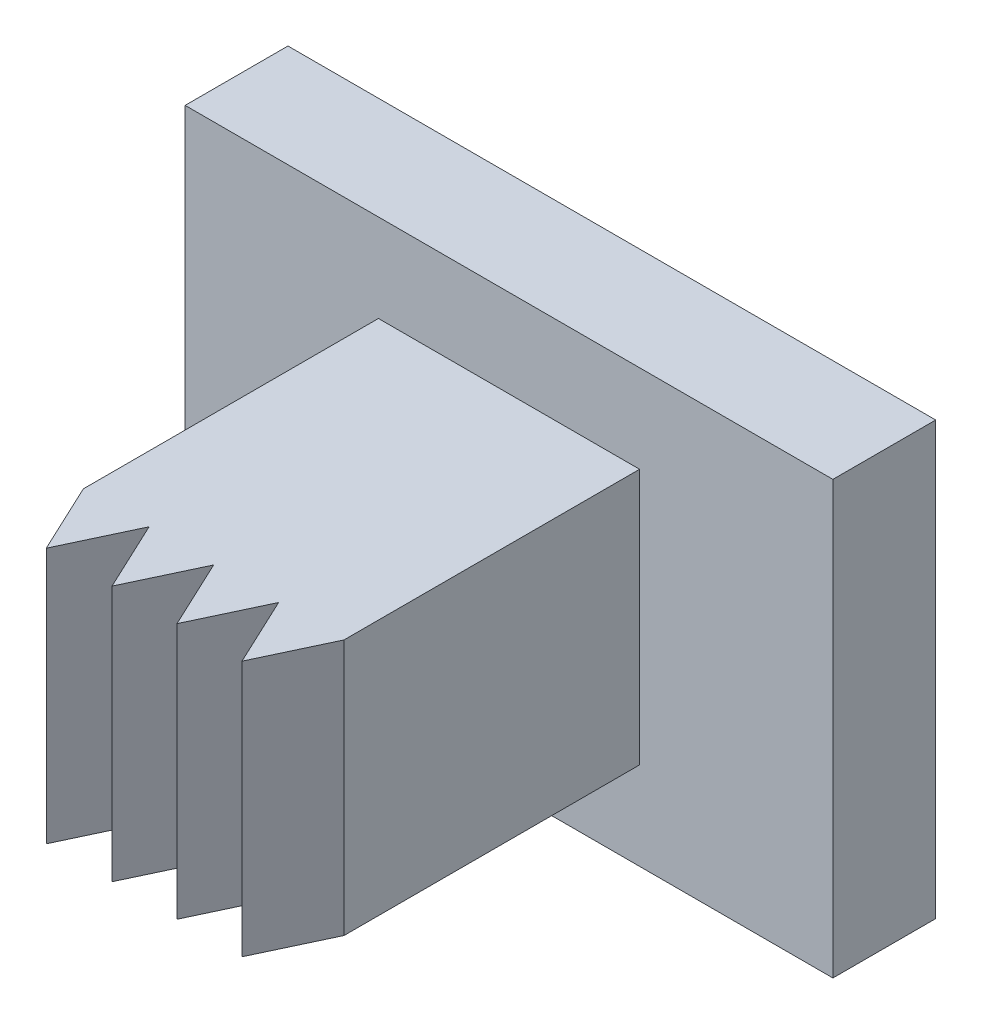
ISO-10303-21;
HEADER;
FILE_DESCRIPTION(('STEP AP214'),'2;1');
FILE_NAME('part.step','',(''),(''),'','','');
FILE_SCHEMA(('AUTOMOTIVE_DESIGN { 1 0 10303 214 1 1 1 1 }'));
ENDSEC;
DATA;
#1=APPLICATION_CONTEXT('core data for automotive mechanical design processes');
#2=APPLICATION_PROTOCOL_DEFINITION('international standard','automotive_design',2000,#1);
#3=PRODUCT_CONTEXT('',#1,'mechanical');
#4=PRODUCT('Part','Part','',(#3));
#5=PRODUCT_RELATED_PRODUCT_CATEGORY('part','',(#4));
#6=PRODUCT_DEFINITION_FORMATION('','',#4);
#7=PRODUCT_DEFINITION_CONTEXT('part definition',#1,'design');
#8=PRODUCT_DEFINITION('design','',#6,#7);
#9=PRODUCT_DEFINITION_SHAPE('','',#8);
#10=(LENGTH_UNIT() NAMED_UNIT(*) SI_UNIT(.MILLI.,.METRE.));
#11=(NAMED_UNIT(*) PLANE_ANGLE_UNIT() SI_UNIT($,.RADIAN.));
#12=(NAMED_UNIT(*) SI_UNIT($,.STERADIAN.) SOLID_ANGLE_UNIT());
#13=UNCERTAINTY_MEASURE_WITH_UNIT(LENGTH_MEASURE(1.E-05),#10,'distance_accuracy_value','');
#14=(GEOMETRIC_REPRESENTATION_CONTEXT(3) GLOBAL_UNCERTAINTY_ASSIGNED_CONTEXT((#13)) GLOBAL_UNIT_ASSIGNED_CONTEXT((#10,
#11,#12)) REPRESENTATION_CONTEXT('',''));
#15=CARTESIAN_POINT('',(0.,0.,0.));
#16=DIRECTION('',(0.,0.,1.));
#17=DIRECTION('',(1.,0.,0.));
#18=AXIS2_PLACEMENT_3D('',#15,#16,#17);
#19=CARTESIAN_POINT('',(0.004562755256311,-1.245,2.87731557566732));
#20=DIRECTION('',(0.905074933327661,0.,-0.425252119409099));
#21=DIRECTION('',(-0.425252119409099,0.,-0.905074933327661));
#22=AXIS2_PLACEMENT_3D('',#19,#20,#21);
#23=PLANE('',#22);
#24=DIRECTION('',(0.,1.,0.));
#25=VECTOR('',#24,1.);
#26=CARTESIAN_POINT('',(0.00456275525631186,-1.245,2.87731557566732));
#27=LINE('',#26,#25);
#28=CARTESIAN_POINT('',(0.00456275525631165,1.245,2.87731557566732));
#29=VERTEX_POINT('',#28);
#30=CARTESIAN_POINT('',(0.00456275525631126,-1.245,2.87731557566732));
#31=VERTEX_POINT('',#30);
#32=EDGE_CURVE('E159',#29,#31,#27,.F.);
#33=ORIENTED_EDGE('',*,*,#32,.T.);
#34=DIRECTION('',(-0.425252119409099,0.,-0.905074933327661));
#35=VECTOR('',#34,1.);
#36=CARTESIAN_POINT('',(0.004562755256311,-1.245,2.87731557566732));
#37=LINE('',#36,#35);
#38=CARTESIAN_POINT('',(0.320625510512622,-1.245,3.55));
#39=VERTEX_POINT('',#38);
#40=EDGE_CURVE('E20',#39,#31,#37,.T.);
#41=ORIENTED_EDGE('',*,*,#40,.F.);
#42=DIRECTION('',(0.,1.,0.));
#43=VECTOR('',#42,1.);
#44=CARTESIAN_POINT('',(0.320625510512622,-1.245,3.55));
#45=LINE('',#44,#43);
#46=CARTESIAN_POINT('',(0.320625510512622,1.245,3.55));
#47=VERTEX_POINT('',#46);
#48=EDGE_CURVE('E169',#39,#47,#45,.T.);
#49=ORIENTED_EDGE('',*,*,#48,.T.);
#50=DIRECTION('',(-0.425252119409099,0.,-0.905074933327661));
#51=VECTOR('',#50,1.);
#52=CARTESIAN_POINT('',(0.00456275525631123,1.245,2.87731557566732));
#53=LINE('',#52,#51);
#54=EDGE_CURVE('E144',#29,#47,#53,.F.);
#55=ORIENTED_EDGE('',*,*,#54,.F.);
#56=EDGE_LOOP('',(#33,#41,#49,#55));
#57=FACE_BOUND('',#56,.T.);
#58=ADVANCED_FACE('F17',(#57),#23,.F.);
#59=CARTESIAN_POINT('',(-0.3115,-1.245,3.55));
#60=DIRECTION('',(-0.90507493332766,0.,-0.4252521194091));
#61=DIRECTION('',(-0.4252521194091,0.,0.90507493332766));
#62=AXIS2_PLACEMENT_3D('',#59,#60,#61);
#63=PLANE('',#62);
#64=DIRECTION('',(0.,1.,0.));
#65=VECTOR('',#64,1.);
#66=CARTESIAN_POINT('',(-0.3115,-1.245,3.55));
#67=LINE('',#66,#65);
#68=CARTESIAN_POINT('',(-0.3115,1.245,3.55));
#69=VERTEX_POINT('',#68);
#70=CARTESIAN_POINT('',(-0.3115,-1.245,3.55));
#71=VERTEX_POINT('',#70);
#72=EDGE_CURVE('E162',#69,#71,#67,.F.);
#73=ORIENTED_EDGE('',*,*,#72,.T.);
#74=DIRECTION('',(-0.4252521194091,0.,0.90507493332766));
#75=VECTOR('',#74,1.);
#76=CARTESIAN_POINT('',(-0.3115,-1.245,3.55));
#77=LINE('',#76,#75);
#78=EDGE_CURVE('E151',#31,#71,#77,.T.);
#79=ORIENTED_EDGE('',*,*,#78,.F.);
#80=ORIENTED_EDGE('',*,*,#32,.F.);
#81=DIRECTION('',(-0.4252521194091,0.,0.90507493332766));
#82=VECTOR('',#81,1.);
#83=CARTESIAN_POINT('',(-0.3115,1.245,3.55));
#84=LINE('',#83,#82);
#85=EDGE_CURVE('E163',#69,#29,#84,.F.);
#86=ORIENTED_EDGE('',*,*,#85,.F.);
#87=EDGE_LOOP('',(#73,#79,#80,#86));
#88=FACE_BOUND('',#87,.T.);
#89=ADVANCED_FACE('F158',(#88),#63,.F.);
#90=CARTESIAN_POINT('',(0.320625510512622,-1.245,3.55));
#91=DIRECTION('',(-0.90507493332766,0.,-0.4252521194091));
#92=DIRECTION('',(-0.4252521194091,0.,0.90507493332766));
#93=AXIS2_PLACEMENT_3D('',#90,#91,#92);
#94=PLANE('',#93);
#95=ORIENTED_EDGE('',*,*,#48,.F.);
#96=DIRECTION('',(-0.4252521194091,0.,0.90507493332766));
#97=VECTOR('',#96,1.);
#98=CARTESIAN_POINT('',(0.320625510512622,-1.245,3.55));
#99=LINE('',#98,#97);
#100=CARTESIAN_POINT('',(0.636688265768935,-1.245,2.87731557566732));
#101=VERTEX_POINT('',#100);
#102=EDGE_CURVE('E154',#101,#39,#99,.T.);
#103=ORIENTED_EDGE('',*,*,#102,.F.);
#104=DIRECTION('',(0.,1.,0.));
#105=VECTOR('',#104,1.);
#106=CARTESIAN_POINT('',(0.636688265768935,-1.245,2.87731557566732));
#107=LINE('',#106,#105);
#108=CARTESIAN_POINT('',(0.636688265768935,1.245,2.87731557566732));
#109=VERTEX_POINT('',#108);
#110=EDGE_CURVE('E181',#101,#109,#107,.T.);
#111=ORIENTED_EDGE('',*,*,#110,.T.);
#112=DIRECTION('',(-0.4252521194091,0.,0.90507493332766));
#113=VECTOR('',#112,1.);
#114=CARTESIAN_POINT('',(0.320625510512622,1.245,3.55));
#115=LINE('',#114,#113);
#116=EDGE_CURVE('E171',#47,#109,#115,.F.);
#117=ORIENTED_EDGE('',*,*,#116,.F.);
#118=EDGE_LOOP('',(#95,#103,#111,#117));
#119=FACE_BOUND('',#118,.T.);
#120=ADVANCED_FACE('F377',(#119),#94,.F.);
#121=CARTESIAN_POINT('',(-0.631,-1.245,2.87));
#122=DIRECTION('',(0.905074933327661,0.,-0.425252119409099));
#123=DIRECTION('',(-0.425252119409099,0.,-0.905074933327661));
#124=AXIS2_PLACEMENT_3D('',#121,#122,#123);
#125=PLANE('',#124);
#126=DIRECTION('',(0.,1.,0.));
#127=VECTOR('',#126,1.);
#128=CARTESIAN_POINT('',(-0.630999999999999,-1.245,2.87));
#129=LINE('',#128,#127);
#130=CARTESIAN_POINT('',(-0.630999999999999,1.245,2.87));
#131=VERTEX_POINT('',#130);
#132=CARTESIAN_POINT('',(-0.631,-1.245,2.87));
#133=VERTEX_POINT('',#132);
#134=EDGE_CURVE('E186',#131,#133,#129,.F.);
#135=ORIENTED_EDGE('',*,*,#134,.T.);
#136=DIRECTION('',(-0.425252119409099,0.,-0.905074933327661));
#137=VECTOR('',#136,1.);
#138=CARTESIAN_POINT('',(-0.631,-1.245,2.87));
#139=LINE('',#138,#137);
#140=EDGE_CURVE('E174',#71,#133,#139,.T.);
#141=ORIENTED_EDGE('',*,*,#140,.F.);
#142=ORIENTED_EDGE('',*,*,#72,.F.);
#143=DIRECTION('',(-0.425252119409099,0.,-0.905074933327661));
#144=VECTOR('',#143,1.);
#145=CARTESIAN_POINT('',(-0.631,1.245,2.87));
#146=LINE('',#145,#144);
#147=EDGE_CURVE('E176',#131,#69,#146,.F.);
#148=ORIENTED_EDGE('',*,*,#147,.F.);
#149=EDGE_LOOP('',(#135,#141,#142,#148));
#150=FACE_BOUND('',#149,.T.);
#151=ADVANCED_FACE('F373',(#150),#125,.F.);
#152=CARTESIAN_POINT('',(0.636688265768935,-1.245,2.87731557566732));
#153=DIRECTION('',(0.905074933327661,0.,-0.425252119409099));
#154=DIRECTION('',(-0.425252119409099,0.,-0.905074933327661));
#155=AXIS2_PLACEMENT_3D('',#152,#153,#154);
#156=PLANE('',#155);
#157=ORIENTED_EDGE('',*,*,#110,.F.);
#158=DIRECTION('',(-0.425252119409099,0.,-0.905074933327661));
#159=VECTOR('',#158,1.);
#160=CARTESIAN_POINT('',(0.636688265768935,-1.245,2.87731557566732));
#161=LINE('',#160,#159);
#162=CARTESIAN_POINT('',(0.952751021025247,-1.245,3.55));
#163=VERTEX_POINT('',#162);
#164=EDGE_CURVE('E179',#163,#101,#161,.T.);
#165=ORIENTED_EDGE('',*,*,#164,.F.);
#166=DIRECTION('',(0.,1.,0.));
#167=VECTOR('',#166,1.);
#168=CARTESIAN_POINT('',(0.952751021025247,-1.245,3.55));
#169=LINE('',#168,#167);
#170=CARTESIAN_POINT('',(0.952751021025247,1.245,3.55));
#171=VERTEX_POINT('',#170);
#172=EDGE_CURVE('E197',#163,#171,#169,.T.);
#173=ORIENTED_EDGE('',*,*,#172,.T.);
#174=DIRECTION('',(-0.425252119409099,0.,-0.905074933327661));
#175=VECTOR('',#174,1.);
#176=CARTESIAN_POINT('',(0.636688265768935,1.245,2.87731557566732));
#177=LINE('',#176,#175);
#178=EDGE_CURVE('E184',#109,#171,#177,.F.);
#179=ORIENTED_EDGE('',*,*,#178,.F.);
#180=EDGE_LOOP('',(#157,#165,#173,#179));
#181=FACE_BOUND('',#180,.T.);
#182=ADVANCED_FACE('F369',(#181),#156,.F.);
#183=CARTESIAN_POINT('',(-0.9505,-1.245,3.55));
#184=DIRECTION('',(-0.90507493332766,0.,-0.4252521194091));
#185=DIRECTION('',(-0.4252521194091,0.,0.90507493332766));
#186=AXIS2_PLACEMENT_3D('',#183,#184,#185);
#187=PLANE('',#186);
#188=DIRECTION('',(0.,1.,0.));
#189=VECTOR('',#188,1.);
#190=CARTESIAN_POINT('',(-0.9505,-1.245,3.55));
#191=LINE('',#190,#189);
#192=CARTESIAN_POINT('',(-0.9505,1.245,3.55));
#193=VERTEX_POINT('',#192);
#194=CARTESIAN_POINT('',(-0.9505,-1.245,3.55));
#195=VERTEX_POINT('',#194);
#196=EDGE_CURVE('E202',#193,#195,#191,.F.);
#197=ORIENTED_EDGE('',*,*,#196,.T.);
#198=DIRECTION('',(-0.4252521194091,0.,0.90507493332766));
#199=VECTOR('',#198,1.);
#200=CARTESIAN_POINT('',(-0.9505,-1.245,3.55));
#201=LINE('',#200,#199);
#202=EDGE_CURVE('E189',#133,#195,#201,.T.);
#203=ORIENTED_EDGE('',*,*,#202,.F.);
#204=ORIENTED_EDGE('',*,*,#134,.F.);
#205=DIRECTION('',(-0.4252521194091,0.,0.90507493332766));
#206=VECTOR('',#205,1.);
#207=CARTESIAN_POINT('',(-0.9505,1.245,3.55));
#208=LINE('',#207,#206);
#209=EDGE_CURVE('E191',#193,#131,#208,.F.);
#210=ORIENTED_EDGE('',*,*,#209,.F.);
#211=EDGE_LOOP('',(#197,#203,#204,#210));
#212=FACE_BOUND('',#211,.T.);
#213=ADVANCED_FACE('F365',(#212),#187,.F.);
#214=CARTESIAN_POINT('',(0.952751021025247,-1.245,3.55));
#215=DIRECTION('',(-0.90507493332766,0.,-0.425252119409101));
#216=DIRECTION('',(-0.425252119409101,0.,0.90507493332766));
#217=AXIS2_PLACEMENT_3D('',#214,#215,#216);
#218=PLANE('',#217);
#219=ORIENTED_EDGE('',*,*,#172,.F.);
#220=DIRECTION('',(-0.425252119409101,0.,0.90507493332766));
#221=VECTOR('',#220,1.);
#222=CARTESIAN_POINT('',(0.952751021025247,-1.245,3.55));
#223=LINE('',#222,#221);
#224=CARTESIAN_POINT('',(1.27,-1.245,2.87479090546845));
#225=VERTEX_POINT('',#224);
#226=EDGE_CURVE('E194',#225,#163,#223,.T.);
#227=ORIENTED_EDGE('',*,*,#226,.F.);
#228=DIRECTION('',(0.,1.,0.));
#229=VECTOR('',#228,1.);
#230=CARTESIAN_POINT('',(1.27,1.245,2.87479090546845));
#231=LINE('',#230,#229);
#232=CARTESIAN_POINT('',(1.27,1.245,2.87479090546845));
#233=VERTEX_POINT('',#232);
#234=EDGE_CURVE('E208',#233,#225,#231,.F.);
#235=ORIENTED_EDGE('',*,*,#234,.F.);
#236=DIRECTION('',(-0.425252119409101,0.,0.90507493332766));
#237=VECTOR('',#236,1.);
#238=CARTESIAN_POINT('',(0.952751021025247,1.245,3.55));
#239=LINE('',#238,#237);
#240=EDGE_CURVE('E200',#171,#233,#239,.F.);
#241=ORIENTED_EDGE('',*,*,#240,.F.);
#242=EDGE_LOOP('',(#219,#227,#235,#241));
#243=FACE_BOUND('',#242,.T.);
#244=ADVANCED_FACE('F361',(#243),#218,.F.);
#245=CARTESIAN_POINT('',(-1.27,-1.245,2.87));
#246=DIRECTION('',(0.905074933327661,0.,-0.425252119409099));
#247=DIRECTION('',(-0.425252119409099,0.,-0.905074933327661));
#248=AXIS2_PLACEMENT_3D('',#245,#246,#247);
#249=PLANE('',#248);
#250=DIRECTION('',(0.,1.,0.));
#251=VECTOR('',#250,1.);
#252=CARTESIAN_POINT('',(-1.27,-1.245,2.87));
#253=LINE('',#252,#251);
#254=CARTESIAN_POINT('',(-1.27,-1.245,2.87));
#255=VERTEX_POINT('',#254);
#256=CARTESIAN_POINT('',(-1.27,1.245,2.87));
#257=VERTEX_POINT('',#256);
#258=EDGE_CURVE('E216',#255,#257,#253,.T.);
#259=ORIENTED_EDGE('',*,*,#258,.F.);
#260=DIRECTION('',(-0.425252119409099,0.,-0.905074933327661));
#261=VECTOR('',#260,1.);
#262=CARTESIAN_POINT('',(-0.9505,-1.245,3.55));
#263=LINE('',#262,#261);
#264=EDGE_CURVE('E211',#195,#255,#263,.T.);
#265=ORIENTED_EDGE('',*,*,#264,.F.);
#266=ORIENTED_EDGE('',*,*,#196,.F.);
#267=DIRECTION('',(-0.425252119409099,0.,-0.905074933327661));
#268=VECTOR('',#267,1.);
#269=CARTESIAN_POINT('',(-1.27,1.245,2.87));
#270=LINE('',#269,#268);
#271=EDGE_CURVE('E205',#257,#193,#270,.F.);
#272=ORIENTED_EDGE('',*,*,#271,.F.);
#273=EDGE_LOOP('',(#259,#265,#266,#272));
#274=FACE_BOUND('',#273,.T.);
#275=ADVANCED_FACE('F357',(#274),#249,.F.);
#276=CARTESIAN_POINT('',(1.27,1.245,0.));
#277=DIRECTION('',(1.,0.,0.));
#278=DIRECTION('',(0.,0.,-1.));
#279=AXIS2_PLACEMENT_3D('',#276,#277,#278);
#280=PLANE('',#279);
#281=DIRECTION('',(0.,1.,0.));
#282=VECTOR('',#281,1.);
#283=CARTESIAN_POINT('',(1.27,0.,0.));
#284=LINE('',#283,#282);
#285=CARTESIAN_POINT('',(1.27,1.245,0.));
#286=VERTEX_POINT('',#285);
#287=CARTESIAN_POINT('',(1.27,-1.245,0.));
#288=VERTEX_POINT('',#287);
#289=EDGE_CURVE('E227',#286,#288,#284,.F.);
#290=ORIENTED_EDGE('',*,*,#289,.F.);
#291=DIRECTION('',(0.,0.,1.));
#292=VECTOR('',#291,1.);
#293=CARTESIAN_POINT('',(1.27,1.245,0.));
#294=LINE('',#293,#292);
#295=EDGE_CURVE('E222',#233,#286,#294,.F.);
#296=ORIENTED_EDGE('',*,*,#295,.F.);
#297=ORIENTED_EDGE('',*,*,#234,.T.);
#298=DIRECTION('',(0.,0.,-1.));
#299=VECTOR('',#298,1.);
#300=CARTESIAN_POINT('',(1.27,-1.245,0.));
#301=LINE('',#300,#299);
#302=EDGE_CURVE('E213',#288,#225,#301,.F.);
#303=ORIENTED_EDGE('',*,*,#302,.F.);
#304=EDGE_LOOP('',(#290,#296,#297,#303));
#305=FACE_BOUND('',#304,.T.);
#306=ADVANCED_FACE('F354',(#305),#280,.T.);
#307=CARTESIAN_POINT('',(1.27,-1.245,0.));
#308=DIRECTION('',(0.,-1.,0.));
#309=DIRECTION('',(0.,0.,-1.));
#310=AXIS2_PLACEMENT_3D('',#307,#308,#309);
#311=PLANE('',#310);
#312=ORIENTED_EDGE('',*,*,#140,.T.);
#313=ORIENTED_EDGE('',*,*,#202,.T.);
#314=ORIENTED_EDGE('',*,*,#264,.T.);
#315=DIRECTION('',(0.,0.,1.));
#316=VECTOR('',#315,1.);
#317=CARTESIAN_POINT('',(-1.27,-1.245,0.));
#318=LINE('',#317,#316);
#319=CARTESIAN_POINT('',(-1.27,-1.245,0.));
#320=VERTEX_POINT('',#319);
#321=EDGE_CURVE('E219',#320,#255,#318,.T.);
#322=ORIENTED_EDGE('',*,*,#321,.F.);
#323=DIRECTION('',(1.,0.,0.));
#324=VECTOR('',#323,1.);
#325=CARTESIAN_POINT('',(0.,-1.245,0.));
#326=LINE('',#325,#324);
#327=EDGE_CURVE('E229',#288,#320,#326,.F.);
#328=ORIENTED_EDGE('',*,*,#327,.F.);
#329=ORIENTED_EDGE('',*,*,#302,.T.);
#330=ORIENTED_EDGE('',*,*,#226,.T.);
#331=ORIENTED_EDGE('',*,*,#164,.T.);
#332=ORIENTED_EDGE('',*,*,#102,.T.);
#333=ORIENTED_EDGE('',*,*,#40,.T.);
#334=ORIENTED_EDGE('',*,*,#78,.T.);
#335=EDGE_LOOP('',(#312,#313,#314,#322,#328,#329,#330,#331,#332,#333,#334));
#336=FACE_BOUND('',#335,.T.);
#337=ADVANCED_FACE('F150',(#336),#311,.T.);
#338=CARTESIAN_POINT('',(-1.27,-1.245,0.));
#339=DIRECTION('',(-1.,0.,0.));
#340=DIRECTION('',(0.,0.,1.));
#341=AXIS2_PLACEMENT_3D('',#338,#339,#340);
#342=PLANE('',#341);
#343=DIRECTION('',(0.,1.,0.));
#344=VECTOR('',#343,1.);
#345=CARTESIAN_POINT('',(-1.27,0.,0.));
#346=LINE('',#345,#344);
#347=CARTESIAN_POINT('',(-1.27,1.245,0.));
#348=VERTEX_POINT('',#347);
#349=EDGE_CURVE('E231',#320,#348,#346,.T.);
#350=ORIENTED_EDGE('',*,*,#349,.F.);
#351=ORIENTED_EDGE('',*,*,#321,.T.);
#352=ORIENTED_EDGE('',*,*,#258,.T.);
#353=DIRECTION('',(0.,0.,1.));
#354=VECTOR('',#353,1.);
#355=CARTESIAN_POINT('',(-1.27,1.245,0.));
#356=LINE('',#355,#354);
#357=EDGE_CURVE('E224',#348,#257,#356,.T.);
#358=ORIENTED_EDGE('',*,*,#357,.F.);
#359=EDGE_LOOP('',(#350,#351,#352,#358));
#360=FACE_BOUND('',#359,.T.);
#361=ADVANCED_FACE('F347',(#360),#342,.T.);
#362=CARTESIAN_POINT('',(-1.27,1.245,0.));
#363=DIRECTION('',(0.,1.,0.));
#364=DIRECTION('',(0.,0.,1.));
#365=AXIS2_PLACEMENT_3D('',#362,#363,#364);
#366=PLANE('',#365);
#367=DIRECTION('',(1.,0.,0.));
#368=VECTOR('',#367,1.);
#369=CARTESIAN_POINT('',(0.,1.245,0.));
#370=LINE('',#369,#368);
#371=EDGE_CURVE('E233',#348,#286,#370,.T.);
#372=ORIENTED_EDGE('',*,*,#371,.F.);
#373=ORIENTED_EDGE('',*,*,#357,.T.);
#374=ORIENTED_EDGE('',*,*,#271,.T.);
#375=ORIENTED_EDGE('',*,*,#209,.T.);
#376=ORIENTED_EDGE('',*,*,#147,.T.);
#377=ORIENTED_EDGE('',*,*,#85,.T.);
#378=ORIENTED_EDGE('',*,*,#54,.T.);
#379=ORIENTED_EDGE('',*,*,#116,.T.);
#380=ORIENTED_EDGE('',*,*,#178,.T.);
#381=ORIENTED_EDGE('',*,*,#240,.T.);
#382=ORIENTED_EDGE('',*,*,#295,.T.);
#383=EDGE_LOOP('',(#372,#373,#374,#375,#376,#377,#378,#379,#380,#381,#382));
#384=FACE_BOUND('',#383,.T.);
#385=ADVANCED_FACE('F343',(#384),#366,.T.);
#386=CARTESIAN_POINT('',(0.,0.,0.));
#387=DIRECTION('',(0.,0.,1.));
#388=DIRECTION('',(1.,0.,0.));
#389=AXIS2_PLACEMENT_3D('',#386,#387,#388);
#390=PLANE('',#389);
#391=ORIENTED_EDGE('',*,*,#349,.T.);
#392=ORIENTED_EDGE('',*,*,#371,.T.);
#393=ORIENTED_EDGE('',*,*,#289,.T.);
#394=ORIENTED_EDGE('',*,*,#327,.T.);
#395=EDGE_LOOP('',(#391,#392,#393,#394));
#396=FACE_BOUND('',#395,.T.);
#397=DIRECTION('',(1.,0.,0.));
#398=VECTOR('',#397,1.);
#399=CARTESIAN_POINT('',(3.15,2.1,0.));
#400=LINE('',#399,#398);
#401=CARTESIAN_POINT('',(-3.15,2.1,0.));
#402=VERTEX_POINT('',#401);
#403=CARTESIAN_POINT('',(3.15,2.1,0.));
#404=VERTEX_POINT('',#403);
#405=EDGE_CURVE('E236',#402,#404,#400,.T.);
#406=ORIENTED_EDGE('',*,*,#405,.F.);
#407=DIRECTION('',(0.,1.,0.));
#408=VECTOR('',#407,1.);
#409=CARTESIAN_POINT('',(-3.15,2.1,0.));
#410=LINE('',#409,#408);
#411=CARTESIAN_POINT('',(-3.15,-2.1,0.));
#412=VERTEX_POINT('',#411);
#413=EDGE_CURVE('E238',#412,#402,#410,.T.);
#414=ORIENTED_EDGE('',*,*,#413,.F.);
#415=DIRECTION('',(1.,0.,0.));
#416=VECTOR('',#415,1.);
#417=CARTESIAN_POINT('',(-3.15,-2.1,0.));
#418=LINE('',#417,#416);
#419=CARTESIAN_POINT('',(3.15,-2.1,0.));
#420=VERTEX_POINT('',#419);
#421=EDGE_CURVE('E242',#420,#412,#418,.F.);
#422=ORIENTED_EDGE('',*,*,#421,.F.);
#423=DIRECTION('',(0.,1.,0.));
#424=VECTOR('',#423,1.);
#425=CARTESIAN_POINT('',(3.15,-2.1,0.));
#426=LINE('',#425,#424);
#427=EDGE_CURVE('E249',#404,#420,#426,.F.);
#428=ORIENTED_EDGE('',*,*,#427,.F.);
#429=EDGE_LOOP('',(#406,#414,#422,#428));
#430=FACE_BOUND('',#429,.T.);
#431=ADVANCED_FACE('F339',(#396,#430),#390,.T.);
#432=CARTESIAN_POINT('',(0.,0.,-1.65));
#433=DIRECTION('',(0.,0.,1.));
#434=DIRECTION('',(1.,0.,0.));
#435=AXIS2_PLACEMENT_3D('',#432,#433,#434);
#436=PLANE('',#435);
#437=DIRECTION('',(1.,0.,0.));
#438=VECTOR('',#437,1.);
#439=CARTESIAN_POINT('',(-1.25,-1.225,-1.65));
#440=LINE('',#439,#438);
#441=CARTESIAN_POINT('',(-1.25,-1.225,-1.65));
#442=VERTEX_POINT('',#441);
#443=CARTESIAN_POINT('',(1.25,-1.225,-1.65));
#444=VERTEX_POINT('',#443);
#445=EDGE_CURVE('E253',#442,#444,#440,.T.);
#446=ORIENTED_EDGE('',*,*,#445,.F.);
#447=DIRECTION('',(0.,1.,0.));
#448=VECTOR('',#447,1.);
#449=CARTESIAN_POINT('',(-1.25,1.225,-1.65));
#450=LINE('',#449,#448);
#451=CARTESIAN_POINT('',(-1.25,1.225,-1.65));
#452=VERTEX_POINT('',#451);
#453=EDGE_CURVE('E255',#452,#442,#450,.F.);
#454=ORIENTED_EDGE('',*,*,#453,.F.);
#455=DIRECTION('',(1.,0.,0.));
#456=VECTOR('',#455,1.);
#457=CARTESIAN_POINT('',(1.25,1.225,-1.65));
#458=LINE('',#457,#456);
#459=CARTESIAN_POINT('',(1.25,1.225,-1.65));
#460=VERTEX_POINT('',#459);
#461=EDGE_CURVE('E259',#460,#452,#458,.F.);
#462=ORIENTED_EDGE('',*,*,#461,.F.);
#463=DIRECTION('',(0.,1.,0.));
#464=VECTOR('',#463,1.);
#465=CARTESIAN_POINT('',(1.25,-1.225,-1.65));
#466=LINE('',#465,#464);
#467=EDGE_CURVE('E263',#444,#460,#466,.T.);
#468=ORIENTED_EDGE('',*,*,#467,.F.);
#469=EDGE_LOOP('',(#446,#454,#462,#468));
#470=FACE_BOUND('',#469,.T.);
#471=ADVANCED_FACE('F335',(#470),#436,.F.);
#472=CARTESIAN_POINT('',(3.15,2.1,0.));
#473=DIRECTION('',(0.,1.,0.));
#474=DIRECTION('',(0.,0.,1.));
#475=AXIS2_PLACEMENT_3D('',#472,#473,#474);
#476=PLANE('',#475);
#477=ORIENTED_EDGE('',*,*,#405,.T.);
#478=DIRECTION('',(0.,0.,-1.));
#479=VECTOR('',#478,1.);
#480=CARTESIAN_POINT('',(3.15,2.1,0.));
#481=LINE('',#480,#479);
#482=CARTESIAN_POINT('',(3.15,2.1,-1.));
#483=VERTEX_POINT('',#482);
#484=EDGE_CURVE('E246',#483,#404,#481,.F.);
#485=ORIENTED_EDGE('',*,*,#484,.F.);
#486=DIRECTION('',(1.,0.,0.));
#487=VECTOR('',#486,1.);
#488=CARTESIAN_POINT('',(0.,2.1,-1.));
#489=LINE('',#488,#487);
#490=CARTESIAN_POINT('',(-3.15,2.1,-1.));
#491=VERTEX_POINT('',#490);
#492=EDGE_CURVE('E269',#483,#491,#489,.F.);
#493=ORIENTED_EDGE('',*,*,#492,.T.);
#494=DIRECTION('',(0.,0.,1.));
#495=VECTOR('',#494,1.);
#496=CARTESIAN_POINT('',(-3.15,2.1,0.));
#497=LINE('',#496,#495);
#498=EDGE_CURVE('E240',#402,#491,#497,.F.);
#499=ORIENTED_EDGE('',*,*,#498,.F.);
#500=EDGE_LOOP('',(#477,#485,#493,#499));
#501=FACE_BOUND('',#500,.T.);
#502=ADVANCED_FACE('F331',(#501),#476,.T.);
#503=CARTESIAN_POINT('',(-3.15,2.1,0.));
#504=DIRECTION('',(-1.,0.,0.));
#505=DIRECTION('',(0.,0.,1.));
#506=AXIS2_PLACEMENT_3D('',#503,#504,#505);
#507=PLANE('',#506);
#508=ORIENTED_EDGE('',*,*,#413,.T.);
#509=ORIENTED_EDGE('',*,*,#498,.T.);
#510=DIRECTION('',(0.,1.,0.));
#511=VECTOR('',#510,1.);
#512=CARTESIAN_POINT('',(-3.15,0.,-1.));
#513=LINE('',#512,#511);
#514=CARTESIAN_POINT('',(-3.15,-2.1,-1.));
#515=VERTEX_POINT('',#514);
#516=EDGE_CURVE('E272',#491,#515,#513,.F.);
#517=ORIENTED_EDGE('',*,*,#516,.T.);
#518=DIRECTION('',(0.,0.,-1.));
#519=VECTOR('',#518,1.);
#520=CARTESIAN_POINT('',(-3.15,-2.1,0.));
#521=LINE('',#520,#519);
#522=EDGE_CURVE('E244',#412,#515,#521,.T.);
#523=ORIENTED_EDGE('',*,*,#522,.F.);
#524=EDGE_LOOP('',(#508,#509,#517,#523));
#525=FACE_BOUND('',#524,.T.);
#526=ADVANCED_FACE('F327',(#525),#507,.T.);
#527=CARTESIAN_POINT('',(-3.15,-2.1,0.));
#528=DIRECTION('',(0.,-1.,0.));
#529=DIRECTION('',(0.,0.,-1.));
#530=AXIS2_PLACEMENT_3D('',#527,#528,#529);
#531=PLANE('',#530);
#532=ORIENTED_EDGE('',*,*,#421,.T.);
#533=ORIENTED_EDGE('',*,*,#522,.T.);
#534=DIRECTION('',(1.,0.,0.));
#535=VECTOR('',#534,1.);
#536=CARTESIAN_POINT('',(0.,-2.1,-1.));
#537=LINE('',#536,#535);
#538=CARTESIAN_POINT('',(3.15,-2.1,-1.));
#539=VERTEX_POINT('',#538);
#540=EDGE_CURVE('E275',#515,#539,#537,.T.);
#541=ORIENTED_EDGE('',*,*,#540,.T.);
#542=DIRECTION('',(0.,0.,-1.));
#543=VECTOR('',#542,1.);
#544=CARTESIAN_POINT('',(3.15,-2.1,0.));
#545=LINE('',#544,#543);
#546=EDGE_CURVE('E251',#420,#539,#545,.T.);
#547=ORIENTED_EDGE('',*,*,#546,.F.);
#548=EDGE_LOOP('',(#532,#533,#541,#547));
#549=FACE_BOUND('',#548,.T.);
#550=ADVANCED_FACE('F323',(#549),#531,.T.);
#551=CARTESIAN_POINT('',(3.15,-2.1,0.));
#552=DIRECTION('',(1.,0.,0.));
#553=DIRECTION('',(0.,0.,-1.));
#554=AXIS2_PLACEMENT_3D('',#551,#552,#553);
#555=PLANE('',#554);
#556=ORIENTED_EDGE('',*,*,#427,.T.);
#557=ORIENTED_EDGE('',*,*,#546,.T.);
#558=DIRECTION('',(0.,1.,0.));
#559=VECTOR('',#558,1.);
#560=CARTESIAN_POINT('',(3.15,0.,-1.));
#561=LINE('',#560,#559);
#562=EDGE_CURVE('E278',#539,#483,#561,.T.);
#563=ORIENTED_EDGE('',*,*,#562,.T.);
#564=ORIENTED_EDGE('',*,*,#484,.T.);
#565=EDGE_LOOP('',(#556,#557,#563,#564));
#566=FACE_BOUND('',#565,.T.);
#567=ADVANCED_FACE('F320',(#566),#555,.T.);
#568=CARTESIAN_POINT('',(-1.25,-1.225,-1.));
#569=DIRECTION('',(0.,-1.,0.));
#570=DIRECTION('',(0.,0.,-1.));
#571=AXIS2_PLACEMENT_3D('',#568,#569,#570);
#572=PLANE('',#571);
#573=DIRECTION('',(1.,0.,0.));
#574=VECTOR('',#573,1.);
#575=CARTESIAN_POINT('',(0.,-1.225,-1.));
#576=LINE('',#575,#574);
#577=CARTESIAN_POINT('',(1.25,-1.225,-1.));
#578=VERTEX_POINT('',#577);
#579=CARTESIAN_POINT('',(-1.25,-1.225,-1.));
#580=VERTEX_POINT('',#579);
#581=EDGE_CURVE('E281',#578,#580,#576,.F.);
#582=ORIENTED_EDGE('',*,*,#581,.T.);
#583=DIRECTION('',(0.,0.,1.));
#584=VECTOR('',#583,1.);
#585=CARTESIAN_POINT('',(-1.25,-1.225,-1.));
#586=LINE('',#585,#584);
#587=EDGE_CURVE('E257',#442,#580,#586,.T.);
#588=ORIENTED_EDGE('',*,*,#587,.F.);
#589=ORIENTED_EDGE('',*,*,#445,.T.);
#590=DIRECTION('',(0.,0.,-1.));
#591=VECTOR('',#590,1.);
#592=CARTESIAN_POINT('',(1.25,-1.225,-1.));
#593=LINE('',#592,#591);
#594=EDGE_CURVE('E266',#578,#444,#593,.T.);
#595=ORIENTED_EDGE('',*,*,#594,.F.);
#596=EDGE_LOOP('',(#582,#588,#589,#595));
#597=FACE_BOUND('',#596,.T.);
#598=ADVANCED_FACE('F302',(#597),#572,.T.);
#599=CARTESIAN_POINT('',(-1.25,1.225,-1.));
#600=DIRECTION('',(-1.,0.,0.));
#601=DIRECTION('',(0.,0.,1.));
#602=AXIS2_PLACEMENT_3D('',#599,#600,#601);
#603=PLANE('',#602);
#604=DIRECTION('',(0.,1.,0.));
#605=VECTOR('',#604,1.);
#606=CARTESIAN_POINT('',(-1.25,0.,-1.));
#607=LINE('',#606,#605);
#608=CARTESIAN_POINT('',(-1.25,1.225,-1.));
#609=VERTEX_POINT('',#608);
#610=EDGE_CURVE('E284',#580,#609,#607,.T.);
#611=ORIENTED_EDGE('',*,*,#610,.T.);
#612=DIRECTION('',(0.,0.,1.));
#613=VECTOR('',#612,1.);
#614=CARTESIAN_POINT('',(-1.25,1.225,-1.));
#615=LINE('',#614,#613);
#616=EDGE_CURVE('E261',#452,#609,#615,.T.);
#617=ORIENTED_EDGE('',*,*,#616,.F.);
#618=ORIENTED_EDGE('',*,*,#453,.T.);
#619=ORIENTED_EDGE('',*,*,#587,.T.);
#620=EDGE_LOOP('',(#611,#617,#618,#619));
#621=FACE_BOUND('',#620,.T.);
#622=ADVANCED_FACE('F297',(#621),#603,.T.);
#623=CARTESIAN_POINT('',(1.25,1.225,-1.));
#624=DIRECTION('',(0.,1.,0.));
#625=DIRECTION('',(0.,0.,1.));
#626=AXIS2_PLACEMENT_3D('',#623,#624,#625);
#627=PLANE('',#626);
#628=DIRECTION('',(1.,0.,0.));
#629=VECTOR('',#628,1.);
#630=CARTESIAN_POINT('',(0.,1.225,-1.));
#631=LINE('',#630,#629);
#632=CARTESIAN_POINT('',(1.25,1.225,-1.));
#633=VERTEX_POINT('',#632);
#634=EDGE_CURVE('E26',#609,#633,#631,.T.);
#635=ORIENTED_EDGE('',*,*,#634,.T.);
#636=DIRECTION('',(0.,0.,-1.));
#637=VECTOR('',#636,1.);
#638=CARTESIAN_POINT('',(1.25,1.225,-1.));
#639=LINE('',#638,#637);
#640=EDGE_CURVE('E34',#460,#633,#639,.F.);
#641=ORIENTED_EDGE('',*,*,#640,.F.);
#642=ORIENTED_EDGE('',*,*,#461,.T.);
#643=ORIENTED_EDGE('',*,*,#616,.T.);
#644=EDGE_LOOP('',(#635,#641,#642,#643));
#645=FACE_BOUND('',#644,.T.);
#646=ADVANCED_FACE('F290',(#645),#627,.T.);
#647=CARTESIAN_POINT('',(1.25,-1.225,-1.));
#648=DIRECTION('',(1.,0.,0.));
#649=DIRECTION('',(0.,0.,-1.));
#650=AXIS2_PLACEMENT_3D('',#647,#648,#649);
#651=PLANE('',#650);
#652=DIRECTION('',(0.,1.,0.));
#653=VECTOR('',#652,1.);
#654=CARTESIAN_POINT('',(1.25,0.,-1.));
#655=LINE('',#654,#653);
#656=EDGE_CURVE('E11',#633,#578,#655,.F.);
#657=ORIENTED_EDGE('',*,*,#656,.T.);
#658=ORIENTED_EDGE('',*,*,#594,.T.);
#659=ORIENTED_EDGE('',*,*,#467,.T.);
#660=ORIENTED_EDGE('',*,*,#640,.T.);
#661=EDGE_LOOP('',(#657,#658,#659,#660));
#662=FACE_BOUND('',#661,.T.);
#663=ADVANCED_FACE('F305',(#662),#651,.T.);
#664=CARTESIAN_POINT('',(0.,0.,-1.));
#665=DIRECTION('',(0.,0.,1.));
#666=DIRECTION('',(1.,0.,0.));
#667=AXIS2_PLACEMENT_3D('',#664,#665,#666);
#668=PLANE('',#667);
#669=ORIENTED_EDGE('',*,*,#634,.F.);
#670=ORIENTED_EDGE('',*,*,#610,.F.);
#671=ORIENTED_EDGE('',*,*,#581,.F.);
#672=ORIENTED_EDGE('',*,*,#656,.F.);
#673=EDGE_LOOP('',(#669,#670,#671,#672));
#674=FACE_BOUND('',#673,.T.);
#675=ORIENTED_EDGE('',*,*,#540,.F.);
#676=ORIENTED_EDGE('',*,*,#516,.F.);
#677=ORIENTED_EDGE('',*,*,#492,.F.);
#678=ORIENTED_EDGE('',*,*,#562,.F.);
#679=EDGE_LOOP('',(#675,#676,#677,#678));
#680=FACE_BOUND('',#679,.T.);
#681=ADVANCED_FACE('F294',(#674,#680),#668,.F.);
#682=CLOSED_SHELL('',(#58,#89,#120,#151,#182,#213,#244,#275,#306,#337,#361,#385,#431,#471,#502,
#526,#550,#567,#598,#622,#646,#663,#681));
#683=MANIFOLD_SOLID_BREP('B1',#682);
#684=ADVANCED_BREP_SHAPE_REPRESENTATION('',(#18,#683),#14);
#685=SHAPE_DEFINITION_REPRESENTATION(#9,#684);
ENDSEC;
END-ISO-10303-21;
